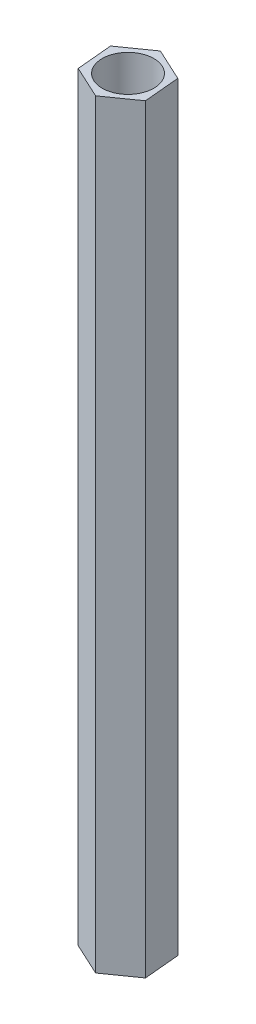
ISO-10303-21;
HEADER;
FILE_DESCRIPTION(('STEP AP214'),'2;1');
FILE_NAME('part.step','',(''),(''),'','','');
FILE_SCHEMA(('AUTOMOTIVE_DESIGN { 1 0 10303 214 1 1 1 1 }'));
ENDSEC;
DATA;
#1=APPLICATION_CONTEXT('core data for automotive mechanical design processes');
#2=APPLICATION_PROTOCOL_DEFINITION('international standard','automotive_design',2000,#1);
#3=PRODUCT_CONTEXT('',#1,'mechanical');
#4=PRODUCT('Part','Part','',(#3));
#5=PRODUCT_RELATED_PRODUCT_CATEGORY('part','',(#4));
#6=PRODUCT_DEFINITION_FORMATION('','',#4);
#7=PRODUCT_DEFINITION_CONTEXT('part definition',#1,'design');
#8=PRODUCT_DEFINITION('design','',#6,#7);
#9=PRODUCT_DEFINITION_SHAPE('','',#8);
#10=(LENGTH_UNIT() NAMED_UNIT(*) SI_UNIT(.MILLI.,.METRE.));
#11=(NAMED_UNIT(*) PLANE_ANGLE_UNIT() SI_UNIT($,.RADIAN.));
#12=(NAMED_UNIT(*) SI_UNIT($,.STERADIAN.) SOLID_ANGLE_UNIT());
#13=UNCERTAINTY_MEASURE_WITH_UNIT(LENGTH_MEASURE(1.E-05),#10,'distance_accuracy_value','');
#14=(GEOMETRIC_REPRESENTATION_CONTEXT(3) GLOBAL_UNCERTAINTY_ASSIGNED_CONTEXT((#13)) GLOBAL_UNIT_ASSIGNED_CONTEXT((#10,
#11,#12)) REPRESENTATION_CONTEXT('',''));
#15=CARTESIAN_POINT('',(0.,0.,0.));
#16=DIRECTION('',(0.,0.,1.));
#17=DIRECTION('',(1.,0.,0.));
#18=AXIS2_PLACEMENT_3D('',#15,#16,#17);
#19=CARTESIAN_POINT('',(0.157089070131564,36.82,1.72491246851694));
#20=DIRECTION('',(-0.576483874079181,0.,-0.817108525794866));
#21=DIRECTION('',(-0.817108525794866,0.,0.576483874079181));
#22=AXIS2_PLACEMENT_3D('',#19,#20,#21);
#23=PLANE('',#22);
#24=DIRECTION('',(0.817108525794866,0.,-0.576483874079181));
#25=VECTOR('',#24,1.);
#26=CARTESIAN_POINT('',(0.157089070131564,0.,1.72491246851694));
#27=LINE('',#26,#25);
#28=CARTESIAN_POINT('',(0.157089070131564,0.,1.72491246851694));
#29=VERTEX_POINT('',#28);
#30=CARTESIAN_POINT('',(1.57236255210598,0.,0.726413108867659));
#31=VERTEX_POINT('',#30);
#32=EDGE_CURVE('E119',#29,#31,#27,.T.);
#33=ORIENTED_EDGE('',*,*,#32,.T.);
#34=DIRECTION('',(0.,-1.,0.));
#35=VECTOR('',#34,1.);
#36=CARTESIAN_POINT('',(1.57236255210598,36.82,0.726413108867659));
#37=LINE('',#36,#35);
#38=CARTESIAN_POINT('',(1.57236255210598,36.82,0.726413108867659));
#39=VERTEX_POINT('',#38);
#40=EDGE_CURVE('E11',#39,#31,#37,.T.);
#41=ORIENTED_EDGE('',*,*,#40,.F.);
#42=DIRECTION('',(0.817108525794866,0.,-0.576483874079181));
#43=VECTOR('',#42,1.);
#44=CARTESIAN_POINT('',(0.157089070131564,36.82,1.72491246851694));
#45=LINE('',#44,#43);
#46=CARTESIAN_POINT('',(0.157089070131564,36.82,1.72491246851694));
#47=VERTEX_POINT('',#46);
#48=EDGE_CURVE('E130',#47,#39,#45,.T.);
#49=ORIENTED_EDGE('',*,*,#48,.F.);
#50=DIRECTION('',(0.,-1.,0.));
#51=VECTOR('',#50,1.);
#52=CARTESIAN_POINT('',(0.157089070131564,36.82,1.72491246851694));
#53=LINE('',#52,#51);
#54=EDGE_CURVE('E115',#47,#29,#53,.T.);
#55=ORIENTED_EDGE('',*,*,#54,.T.);
#56=EDGE_LOOP('',(#33,#41,#49,#55));
#57=FACE_BOUND('',#56,.T.);
#58=ADVANCED_FACE('F35',(#57),#23,.F.);
#59=CARTESIAN_POINT('',(1.57236255210598,36.82,0.726413108867659));
#60=DIRECTION('',(-0.995878678026797,0.,0.0906954169272069));
#61=DIRECTION('',(0.0906954169272069,0.,0.995878678026797));
#62=AXIS2_PLACEMENT_3D('',#59,#60,#61);
#63=PLANE('',#62);
#64=DIRECTION('',(-0.0906954169272068,0.,-0.995878678026797));
#65=VECTOR('',#64,1.);
#66=CARTESIAN_POINT('',(1.57236255210598,0.,0.726413108867659));
#67=LINE('',#66,#65);
#68=CARTESIAN_POINT('',(1.41527348197441,0.,-0.99849935964928));
#69=VERTEX_POINT('',#68);
#70=EDGE_CURVE('E122',#31,#69,#67,.T.);
#71=ORIENTED_EDGE('',*,*,#70,.T.);
#72=DIRECTION('',(0.,-1.,0.));
#73=VECTOR('',#72,1.);
#74=CARTESIAN_POINT('',(1.41527348197441,36.82,-0.99849935964928));
#75=LINE('',#74,#73);
#76=CARTESIAN_POINT('',(1.41527348197441,36.82,-0.99849935964928));
#77=VERTEX_POINT('',#76);
#78=EDGE_CURVE('E43',#77,#69,#75,.T.);
#79=ORIENTED_EDGE('',*,*,#78,.F.);
#80=DIRECTION('',(-0.0906954169272068,0.,-0.995878678026797));
#81=VECTOR('',#80,1.);
#82=CARTESIAN_POINT('',(1.57236255210598,36.82,0.726413108867659));
#83=LINE('',#82,#81);
#84=EDGE_CURVE('E88',#39,#77,#83,.T.);
#85=ORIENTED_EDGE('',*,*,#84,.F.);
#86=ORIENTED_EDGE('',*,*,#40,.T.);
#87=EDGE_LOOP('',(#71,#79,#85,#86));
#88=FACE_BOUND('',#87,.T.);
#89=ADVANCED_FACE('F155',(#88),#63,.F.);
#90=CARTESIAN_POINT('',(1.41527348197441,36.82,-0.99849935964928));
#91=DIRECTION('',(-0.419394803947616,0.,0.907803942722073));
#92=DIRECTION('',(0.907803942722073,0.,0.419394803947616));
#93=AXIS2_PLACEMENT_3D('',#90,#91,#92);
#94=PLANE('',#93);
#95=DIRECTION('',(-0.907803942722073,0.,-0.419394803947616));
#96=VECTOR('',#95,1.);
#97=CARTESIAN_POINT('',(1.41527348197441,0.,-0.99849935964928));
#98=LINE('',#97,#96);
#99=CARTESIAN_POINT('',(-0.157089070131564,0.,-1.72491246851694));
#100=VERTEX_POINT('',#99);
#101=EDGE_CURVE('E125',#69,#100,#98,.T.);
#102=ORIENTED_EDGE('',*,*,#101,.T.);
#103=DIRECTION('',(0.,-1.,0.));
#104=VECTOR('',#103,1.);
#105=CARTESIAN_POINT('',(-0.157089070131564,36.82,-1.72491246851694));
#106=LINE('',#105,#104);
#107=CARTESIAN_POINT('',(-0.157089070131564,36.82,-1.72491246851694));
#108=VERTEX_POINT('',#107);
#109=EDGE_CURVE('E110',#108,#100,#106,.T.);
#110=ORIENTED_EDGE('',*,*,#109,.F.);
#111=DIRECTION('',(-0.907803942722073,0.,-0.419394803947616));
#112=VECTOR('',#111,1.);
#113=CARTESIAN_POINT('',(1.41527348197441,36.82,-0.99849935964928));
#114=LINE('',#113,#112);
#115=EDGE_CURVE('E101',#77,#108,#114,.T.);
#116=ORIENTED_EDGE('',*,*,#115,.F.);
#117=ORIENTED_EDGE('',*,*,#78,.T.);
#118=EDGE_LOOP('',(#102,#110,#116,#117));
#119=FACE_BOUND('',#118,.T.);
#120=ADVANCED_FACE('F136',(#119),#94,.F.);
#121=CARTESIAN_POINT('',(-0.157089070131564,36.82,-1.72491246851694));
#122=DIRECTION('',(0.576483874079181,0.,0.817108525794866));
#123=DIRECTION('',(0.817108525794866,0.,-0.576483874079181));
#124=AXIS2_PLACEMENT_3D('',#121,#122,#123);
#125=PLANE('',#124);
#126=DIRECTION('',(-0.817108525794866,0.,0.576483874079181));
#127=VECTOR('',#126,1.);
#128=CARTESIAN_POINT('',(-0.157089070131564,0.,-1.72491246851694));
#129=LINE('',#128,#127);
#130=CARTESIAN_POINT('',(-1.57236255210598,0.,-0.726413108867659));
#131=VERTEX_POINT('',#130);
#132=EDGE_CURVE('E109',#100,#131,#129,.T.);
#133=ORIENTED_EDGE('',*,*,#132,.T.);
#134=DIRECTION('',(0.,-1.,0.));
#135=VECTOR('',#134,1.);
#136=CARTESIAN_POINT('',(-1.57236255210598,36.82,-0.726413108867659));
#137=LINE('',#136,#135);
#138=CARTESIAN_POINT('',(-1.57236255210598,36.82,-0.726413108867659));
#139=VERTEX_POINT('',#138);
#140=EDGE_CURVE('E106',#139,#131,#137,.T.);
#141=ORIENTED_EDGE('',*,*,#140,.F.);
#142=DIRECTION('',(-0.817108525794866,0.,0.576483874079181));
#143=VECTOR('',#142,1.);
#144=CARTESIAN_POINT('',(-0.157089070131564,36.82,-1.72491246851694));
#145=LINE('',#144,#143);
#146=EDGE_CURVE('E95',#108,#139,#145,.T.);
#147=ORIENTED_EDGE('',*,*,#146,.F.);
#148=ORIENTED_EDGE('',*,*,#109,.T.);
#149=EDGE_LOOP('',(#133,#141,#147,#148));
#150=FACE_BOUND('',#149,.T.);
#151=ADVANCED_FACE('F107',(#150),#125,.F.);
#152=CARTESIAN_POINT('',(-1.57236255210598,36.82,-0.726413108867659));
#153=DIRECTION('',(0.995878678026797,0.,-0.0906954169272065));
#154=DIRECTION('',(-0.0906954169272065,0.,-0.995878678026797));
#155=AXIS2_PLACEMENT_3D('',#152,#153,#154);
#156=PLANE('',#155);
#157=DIRECTION('',(0.0906954169272065,0.,0.995878678026797));
#158=VECTOR('',#157,1.);
#159=CARTESIAN_POINT('',(-1.57236255210598,0.,-0.726413108867659));
#160=LINE('',#159,#158);
#161=CARTESIAN_POINT('',(-1.41527348197441,0.,0.99849935964928));
#162=VERTEX_POINT('',#161);
#163=EDGE_CURVE('E74',#131,#162,#160,.T.);
#164=ORIENTED_EDGE('',*,*,#163,.T.);
#165=DIRECTION('',(0.,-1.,0.));
#166=VECTOR('',#165,1.);
#167=CARTESIAN_POINT('',(-1.41527348197441,36.82,0.99849935964928));
#168=LINE('',#167,#166);
#169=CARTESIAN_POINT('',(-1.41527348197441,36.82,0.99849935964928));
#170=VERTEX_POINT('',#169);
#171=EDGE_CURVE('E111',#170,#162,#168,.T.);
#172=ORIENTED_EDGE('',*,*,#171,.F.);
#173=DIRECTION('',(0.0906954169272065,0.,0.995878678026797));
#174=VECTOR('',#173,1.);
#175=CARTESIAN_POINT('',(-1.57236255210598,36.82,-0.726413108867659));
#176=LINE('',#175,#174);
#177=EDGE_CURVE('E99',#139,#170,#176,.T.);
#178=ORIENTED_EDGE('',*,*,#177,.F.);
#179=ORIENTED_EDGE('',*,*,#140,.T.);
#180=EDGE_LOOP('',(#164,#172,#178,#179));
#181=FACE_BOUND('',#180,.T.);
#182=ADVANCED_FACE('F113',(#181),#156,.F.);
#183=CARTESIAN_POINT('',(-1.41527348197441,36.82,0.99849935964928));
#184=DIRECTION('',(0.419394803947616,0.,-0.907803942722073));
#185=DIRECTION('',(-0.907803942722073,0.,-0.419394803947616));
#186=AXIS2_PLACEMENT_3D('',#183,#184,#185);
#187=PLANE('',#186);
#188=DIRECTION('',(0.907803942722073,0.,0.419394803947616));
#189=VECTOR('',#188,1.);
#190=CARTESIAN_POINT('',(-1.41527348197441,0.,0.99849935964928));
#191=LINE('',#190,#189);
#192=EDGE_CURVE('E80',#162,#29,#191,.T.);
#193=ORIENTED_EDGE('',*,*,#192,.T.);
#194=ORIENTED_EDGE('',*,*,#54,.F.);
#195=DIRECTION('',(0.907803942722073,0.,0.419394803947616));
#196=VECTOR('',#195,1.);
#197=CARTESIAN_POINT('',(-1.41527348197441,36.82,0.99849935964928));
#198=LINE('',#197,#196);
#199=EDGE_CURVE('E51',#170,#47,#198,.T.);
#200=ORIENTED_EDGE('',*,*,#199,.F.);
#201=ORIENTED_EDGE('',*,*,#171,.T.);
#202=EDGE_LOOP('',(#193,#194,#200,#201));
#203=FACE_BOUND('',#202,.T.);
#204=ADVANCED_FACE('F143',(#203),#187,.F.);
#205=CARTESIAN_POINT('',(0.,36.82,0.));
#206=DIRECTION('',(0.,1.,0.));
#207=DIRECTION('',(0.,0.,1.));
#208=AXIS2_PLACEMENT_3D('',#205,#206,#207);
#209=PLANE('',#208);
#210=CARTESIAN_POINT('',(0.,36.82,0.));
#211=DIRECTION('',(0.,1.,0.));
#212=DIRECTION('',(0.,0.,1.));
#213=AXIS2_PLACEMENT_3D('',#210,#211,#212);
#214=CIRCLE('',#213,1.25);
#215=CARTESIAN_POINT('',(0.,36.82,1.25));
#216=VERTEX_POINT('',#215);
#217=EDGE_CURVE('E210',#216,#216,#214,.T.);
#218=ORIENTED_EDGE('',*,*,#217,.F.);
#219=EDGE_LOOP('',(#218));
#220=FACE_BOUND('',#219,.T.);
#221=ORIENTED_EDGE('',*,*,#48,.T.);
#222=ORIENTED_EDGE('',*,*,#84,.T.);
#223=ORIENTED_EDGE('',*,*,#115,.T.);
#224=ORIENTED_EDGE('',*,*,#146,.T.);
#225=ORIENTED_EDGE('',*,*,#177,.T.);
#226=ORIENTED_EDGE('',*,*,#199,.T.);
#227=EDGE_LOOP('',(#221,#222,#223,#224,#225,#226));
#228=FACE_BOUND('',#227,.T.);
#229=ADVANCED_FACE('F97',(#220,#228),#209,.T.);
#230=CARTESIAN_POINT('',(0.,0.,0.));
#231=DIRECTION('',(0.,1.,0.));
#232=DIRECTION('',(0.,0.,1.));
#233=AXIS2_PLACEMENT_3D('',#230,#231,#232);
#234=PLANE('',#233);
#235=CARTESIAN_POINT('',(0.,0.,0.));
#236=DIRECTION('',(0.,1.,0.));
#237=DIRECTION('',(0.,0.,1.));
#238=AXIS2_PLACEMENT_3D('',#235,#236,#237);
#239=CIRCLE('',#238,1.25);
#240=CARTESIAN_POINT('',(0.,0.,1.25));
#241=VERTEX_POINT('',#240);
#242=EDGE_CURVE('E123',#241,#241,#239,.T.);
#243=ORIENTED_EDGE('',*,*,#242,.T.);
#244=EDGE_LOOP('',(#243));
#245=FACE_BOUND('',#244,.T.);
#246=ORIENTED_EDGE('',*,*,#32,.F.);
#247=ORIENTED_EDGE('',*,*,#192,.F.);
#248=ORIENTED_EDGE('',*,*,#163,.F.);
#249=ORIENTED_EDGE('',*,*,#132,.F.);
#250=ORIENTED_EDGE('',*,*,#101,.F.);
#251=ORIENTED_EDGE('',*,*,#70,.F.);
#252=EDGE_LOOP('',(#246,#247,#248,#249,#250,#251));
#253=FACE_BOUND('',#252,.T.);
#254=ADVANCED_FACE('F139',(#245,#253),#234,.F.);
#255=CARTESIAN_POINT('',(0.,0.,0.));
#256=DIRECTION('',(0.,1.,0.));
#257=DIRECTION('',(0.,0.,1.));
#258=AXIS2_PLACEMENT_3D('',#255,#256,#257);
#259=CYLINDRICAL_SURFACE('',#258,1.25);
#260=ORIENTED_EDGE('',*,*,#242,.F.);
#261=EDGE_LOOP('',(#260));
#262=FACE_BOUND('',#261,.T.);
#263=ORIENTED_EDGE('',*,*,#217,.T.);
#264=EDGE_LOOP('',(#263));
#265=FACE_BOUND('',#264,.T.);
#266=ADVANCED_FACE('F192',(#262,#265),#259,.F.);
#267=CLOSED_SHELL('',(#58,#89,#120,#151,#182,#204,#229,#254,#266));
#268=MANIFOLD_SOLID_BREP('B2',#267);
#269=ADVANCED_BREP_SHAPE_REPRESENTATION('',(#18,#268),#14);
#270=SHAPE_DEFINITION_REPRESENTATION(#9,#269);
ENDSEC;
END-ISO-10303-21;
